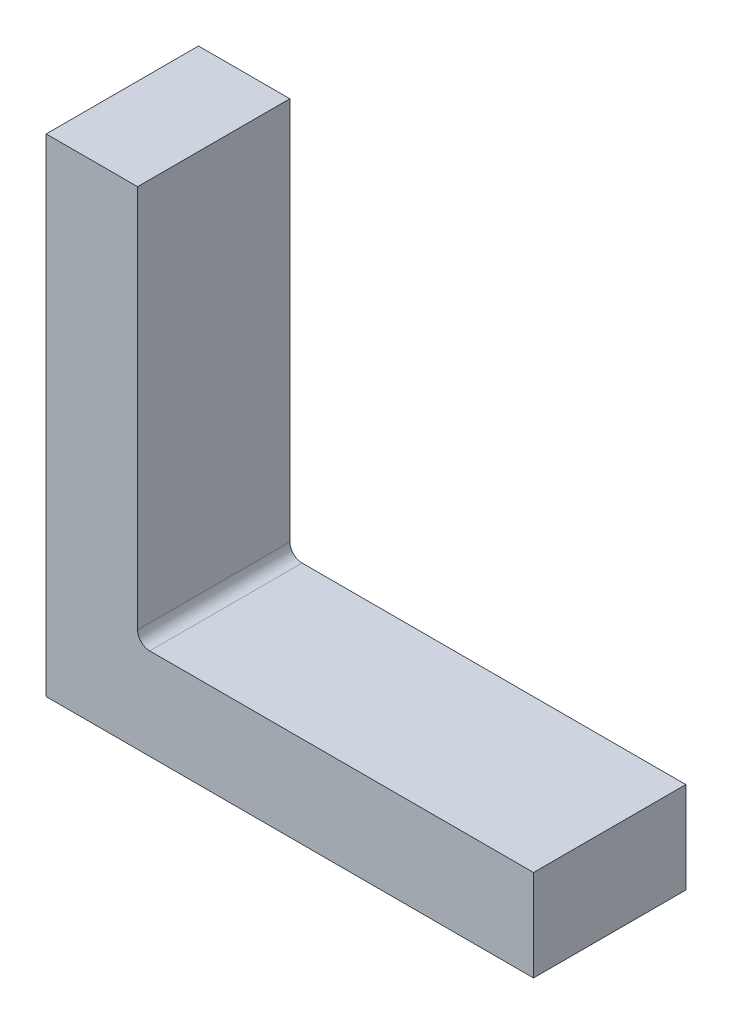
ISO-10303-21;
HEADER;
FILE_DESCRIPTION(('STEP AP214'),'2;1');
FILE_NAME('part.step','',(''),(''),'','','');
FILE_SCHEMA(('AUTOMOTIVE_DESIGN { 1 0 10303 214 1 1 1 1 }'));
ENDSEC;
DATA;
#1=APPLICATION_CONTEXT('core data for automotive mechanical design processes');
#2=APPLICATION_PROTOCOL_DEFINITION('international standard','automotive_design',2000,#1);
#3=PRODUCT_CONTEXT('',#1,'mechanical');
#4=PRODUCT('Part','Part','',(#3));
#5=PRODUCT_RELATED_PRODUCT_CATEGORY('part','',(#4));
#6=PRODUCT_DEFINITION_FORMATION('','',#4);
#7=PRODUCT_DEFINITION_CONTEXT('part definition',#1,'design');
#8=PRODUCT_DEFINITION('design','',#6,#7);
#9=PRODUCT_DEFINITION_SHAPE('','',#8);
#10=(LENGTH_UNIT() NAMED_UNIT(*) SI_UNIT(.MILLI.,.METRE.));
#11=(NAMED_UNIT(*) PLANE_ANGLE_UNIT() SI_UNIT($,.RADIAN.));
#12=(NAMED_UNIT(*) SI_UNIT($,.STERADIAN.) SOLID_ANGLE_UNIT());
#13=UNCERTAINTY_MEASURE_WITH_UNIT(LENGTH_MEASURE(1.E-05),#10,'distance_accuracy_value','');
#14=(GEOMETRIC_REPRESENTATION_CONTEXT(3) GLOBAL_UNCERTAINTY_ASSIGNED_CONTEXT((#13)) GLOBAL_UNIT_ASSIGNED_CONTEXT((#10,
#11,#12)) REPRESENTATION_CONTEXT('',''));
#15=CARTESIAN_POINT('',(0.,0.,0.));
#16=DIRECTION('',(0.,0.,1.));
#17=DIRECTION('',(1.,0.,0.));
#18=AXIS2_PLACEMENT_3D('',#15,#16,#17);
#19=CARTESIAN_POINT('',(0.,0.,31.75));
#20=DIRECTION('',(1.,0.,0.));
#21=DIRECTION('',(0.,0.,-1.));
#22=AXIS2_PLACEMENT_3D('',#19,#20,#21);
#23=PLANE('',#22);
#24=DIRECTION('',(0.,-1.,0.));
#25=VECTOR('',#24,1.);
#26=CARTESIAN_POINT('',(0.,0.,0.));
#27=LINE('',#26,#25);
#28=CARTESIAN_POINT('',(0.,101.6,0.));
#29=VERTEX_POINT('',#28);
#30=CARTESIAN_POINT('',(0.,0.,0.));
#31=VERTEX_POINT('',#30);
#32=EDGE_CURVE('E133',#29,#31,#27,.T.);
#33=ORIENTED_EDGE('',*,*,#32,.T.);
#34=DIRECTION('',(0.,0.,-1.));
#35=VECTOR('',#34,1.);
#36=CARTESIAN_POINT('',(0.,0.,31.75));
#37=LINE('',#36,#35);
#38=CARTESIAN_POINT('',(0.,0.,31.75));
#39=VERTEX_POINT('',#38);
#40=EDGE_CURVE('E112',#39,#31,#37,.T.);
#41=ORIENTED_EDGE('',*,*,#40,.F.);
#42=DIRECTION('',(0.,-1.,0.));
#43=VECTOR('',#42,1.);
#44=CARTESIAN_POINT('',(0.,0.,31.75));
#45=LINE('',#44,#43);
#46=CARTESIAN_POINT('',(0.,101.6,31.75));
#47=VERTEX_POINT('',#46);
#48=EDGE_CURVE('E120',#47,#39,#45,.T.);
#49=ORIENTED_EDGE('',*,*,#48,.F.);
#50=DIRECTION('',(0.,0.,-1.));
#51=VECTOR('',#50,1.);
#52=CARTESIAN_POINT('',(0.,101.6,31.75));
#53=LINE('',#52,#51);
#54=EDGE_CURVE('E157',#47,#29,#53,.T.);
#55=ORIENTED_EDGE('',*,*,#54,.T.);
#56=EDGE_LOOP('',(#33,#41,#49,#55));
#57=FACE_BOUND('',#56,.T.);
#58=ADVANCED_FACE('F48',(#57),#23,.F.);
#59=CARTESIAN_POINT('',(0.,0.,31.75));
#60=DIRECTION('',(0.,1.,0.));
#61=DIRECTION('',(0.,0.,1.));
#62=AXIS2_PLACEMENT_3D('',#59,#60,#61);
#63=PLANE('',#62);
#64=DIRECTION('',(1.,0.,0.));
#65=VECTOR('',#64,1.);
#66=CARTESIAN_POINT('',(0.,0.,0.));
#67=LINE('',#66,#65);
#68=CARTESIAN_POINT('',(101.6,0.,0.));
#69=VERTEX_POINT('',#68);
#70=EDGE_CURVE('E178',#31,#69,#67,.T.);
#71=ORIENTED_EDGE('',*,*,#70,.T.);
#72=DIRECTION('',(0.,0.,-1.));
#73=VECTOR('',#72,1.);
#74=CARTESIAN_POINT('',(101.6,0.,31.75));
#75=LINE('',#74,#73);
#76=CARTESIAN_POINT('',(101.6,0.,31.75));
#77=VERTEX_POINT('',#76);
#78=EDGE_CURVE('E115',#77,#69,#75,.T.);
#79=ORIENTED_EDGE('',*,*,#78,.F.);
#80=DIRECTION('',(1.,0.,0.));
#81=VECTOR('',#80,1.);
#82=CARTESIAN_POINT('',(0.,0.,31.75));
#83=LINE('',#82,#81);
#84=EDGE_CURVE('E108',#39,#77,#83,.T.);
#85=ORIENTED_EDGE('',*,*,#84,.F.);
#86=ORIENTED_EDGE('',*,*,#40,.T.);
#87=EDGE_LOOP('',(#71,#79,#85,#86));
#88=FACE_BOUND('',#87,.T.);
#89=ADVANCED_FACE('F110',(#88),#63,.F.);
#90=CARTESIAN_POINT('',(101.6,0.,31.75));
#91=DIRECTION('',(-1.,0.,0.));
#92=DIRECTION('',(0.,0.,1.));
#93=AXIS2_PLACEMENT_3D('',#90,#91,#92);
#94=PLANE('',#93);
#95=DIRECTION('',(0.,1.,0.));
#96=VECTOR('',#95,1.);
#97=CARTESIAN_POINT('',(101.6,0.,0.));
#98=LINE('',#97,#96);
#99=CARTESIAN_POINT('',(101.6,19.05,0.));
#100=VERTEX_POINT('',#99);
#101=EDGE_CURVE('E174',#69,#100,#98,.T.);
#102=ORIENTED_EDGE('',*,*,#101,.T.);
#103=DIRECTION('',(0.,0.,-1.));
#104=VECTOR('',#103,1.);
#105=CARTESIAN_POINT('',(101.6,19.05,31.75));
#106=LINE('',#105,#104);
#107=CARTESIAN_POINT('',(101.6,19.05,31.75));
#108=VERTEX_POINT('',#107);
#109=EDGE_CURVE('E141',#108,#100,#106,.T.);
#110=ORIENTED_EDGE('',*,*,#109,.F.);
#111=DIRECTION('',(0.,1.,0.));
#112=VECTOR('',#111,1.);
#113=CARTESIAN_POINT('',(101.6,0.,31.75));
#114=LINE('',#113,#112);
#115=EDGE_CURVE('E119',#77,#108,#114,.T.);
#116=ORIENTED_EDGE('',*,*,#115,.F.);
#117=ORIENTED_EDGE('',*,*,#78,.T.);
#118=EDGE_LOOP('',(#102,#110,#116,#117));
#119=FACE_BOUND('',#118,.T.);
#120=ADVANCED_FACE('F194',(#119),#94,.F.);
#121=CARTESIAN_POINT('',(19.05,19.05,31.75));
#122=DIRECTION('',(0.,-1.,0.));
#123=DIRECTION('',(0.,0.,-1.));
#124=AXIS2_PLACEMENT_3D('',#121,#122,#123);
#125=PLANE('',#124);
#126=DIRECTION('',(-1.,0.,0.));
#127=VECTOR('',#126,1.);
#128=CARTESIAN_POINT('',(19.05,19.05,0.));
#129=LINE('',#128,#127);
#130=CARTESIAN_POINT('',(21.59,19.05,0.));
#131=VERTEX_POINT('',#130);
#132=EDGE_CURVE('E169',#100,#131,#129,.T.);
#133=ORIENTED_EDGE('',*,*,#132,.T.);
#134=DIRECTION('',(0.,0.,-1.));
#135=VECTOR('',#134,1.);
#136=CARTESIAN_POINT('',(21.59,19.05,31.75));
#137=LINE('',#136,#135);
#138=CARTESIAN_POINT('',(21.59,19.05,31.75));
#139=VERTEX_POINT('',#138);
#140=EDGE_CURVE('E64',#131,#139,#137,.F.);
#141=ORIENTED_EDGE('',*,*,#140,.T.);
#142=DIRECTION('',(-1.,0.,0.));
#143=VECTOR('',#142,1.);
#144=CARTESIAN_POINT('',(19.05,19.05,31.75));
#145=LINE('',#144,#143);
#146=EDGE_CURVE('E170',#108,#139,#145,.T.);
#147=ORIENTED_EDGE('',*,*,#146,.F.);
#148=ORIENTED_EDGE('',*,*,#109,.T.);
#149=EDGE_LOOP('',(#133,#141,#147,#148));
#150=FACE_BOUND('',#149,.T.);
#151=ADVANCED_FACE('F168',(#150),#125,.F.);
#152=CARTESIAN_POINT('',(19.05,101.6,31.75));
#153=DIRECTION('',(-1.,0.,0.));
#154=DIRECTION('',(0.,-1.,0.));
#155=AXIS2_PLACEMENT_3D('',#152,#153,#154);
#156=PLANE('',#155);
#157=DIRECTION('',(0.,1.,0.));
#158=VECTOR('',#157,1.);
#159=CARTESIAN_POINT('',(19.05,101.6,31.75));
#160=LINE('',#159,#158);
#161=CARTESIAN_POINT('',(19.05,21.59,31.75));
#162=VERTEX_POINT('',#161);
#163=CARTESIAN_POINT('',(19.05,101.6,31.75));
#164=VERTEX_POINT('',#163);
#165=EDGE_CURVE('E187',#162,#164,#160,.T.);
#166=ORIENTED_EDGE('',*,*,#165,.F.);
#167=DIRECTION('',(0.,0.,-1.));
#168=VECTOR('',#167,1.);
#169=CARTESIAN_POINT('',(19.05,21.59,0.));
#170=LINE('',#169,#168);
#171=CARTESIAN_POINT('',(19.05,21.59,0.));
#172=VERTEX_POINT('',#171);
#173=EDGE_CURVE('E135',#162,#172,#170,.T.);
#174=ORIENTED_EDGE('',*,*,#173,.T.);
#175=DIRECTION('',(0.,1.,0.));
#176=VECTOR('',#175,1.);
#177=CARTESIAN_POINT('',(19.05,101.6,0.));
#178=LINE('',#177,#176);
#179=CARTESIAN_POINT('',(19.05,101.6,0.));
#180=VERTEX_POINT('',#179);
#181=EDGE_CURVE('E155',#172,#180,#178,.T.);
#182=ORIENTED_EDGE('',*,*,#181,.T.);
#183=DIRECTION('',(0.,0.,-1.));
#184=VECTOR('',#183,1.);
#185=CARTESIAN_POINT('',(19.05,101.6,31.75));
#186=LINE('',#185,#184);
#187=EDGE_CURVE('E159',#164,#180,#186,.T.);
#188=ORIENTED_EDGE('',*,*,#187,.F.);
#189=EDGE_LOOP('',(#166,#174,#182,#188));
#190=FACE_BOUND('',#189,.T.);
#191=ADVANCED_FACE('F200',(#190),#156,.F.);
#192=CARTESIAN_POINT('',(0.,101.6,31.75));
#193=DIRECTION('',(0.,-1.,0.));
#194=DIRECTION('',(0.,0.,-1.));
#195=AXIS2_PLACEMENT_3D('',#192,#193,#194);
#196=PLANE('',#195);
#197=DIRECTION('',(-1.,0.,0.));
#198=VECTOR('',#197,1.);
#199=CARTESIAN_POINT('',(0.,101.6,0.));
#200=LINE('',#199,#198);
#201=EDGE_CURVE('E130',#180,#29,#200,.T.);
#202=ORIENTED_EDGE('',*,*,#201,.T.);
#203=ORIENTED_EDGE('',*,*,#54,.F.);
#204=DIRECTION('',(-1.,0.,0.));
#205=VECTOR('',#204,1.);
#206=CARTESIAN_POINT('',(0.,101.6,31.75));
#207=LINE('',#206,#205);
#208=EDGE_CURVE('E125',#164,#47,#207,.T.);
#209=ORIENTED_EDGE('',*,*,#208,.F.);
#210=ORIENTED_EDGE('',*,*,#187,.T.);
#211=EDGE_LOOP('',(#202,#203,#209,#210));
#212=FACE_BOUND('',#211,.T.);
#213=ADVANCED_FACE('F229',(#212),#196,.F.);
#214=CARTESIAN_POINT('',(0.,101.6,31.75));
#215=DIRECTION('',(0.,0.,-1.));
#216=DIRECTION('',(-1.,0.,0.));
#217=AXIS2_PLACEMENT_3D('',#214,#215,#216);
#218=PLANE('',#217);
#219=ORIENTED_EDGE('',*,*,#48,.T.);
#220=ORIENTED_EDGE('',*,*,#84,.T.);
#221=ORIENTED_EDGE('',*,*,#115,.T.);
#222=ORIENTED_EDGE('',*,*,#146,.T.);
#223=CARTESIAN_POINT('',(21.59,21.59,31.75));
#224=DIRECTION('',(0.,0.,-1.));
#225=DIRECTION('',(-1.,0.,0.));
#226=AXIS2_PLACEMENT_3D('',#223,#224,#225);
#227=CIRCLE('',#226,2.54);
#228=EDGE_CURVE('E12',#139,#162,#227,.T.);
#229=ORIENTED_EDGE('',*,*,#228,.T.);
#230=ORIENTED_EDGE('',*,*,#165,.T.);
#231=ORIENTED_EDGE('',*,*,#208,.T.);
#232=EDGE_LOOP('',(#219,#220,#221,#222,#229,#230,#231));
#233=FACE_BOUND('',#232,.T.);
#234=ADVANCED_FACE('F123',(#233),#218,.F.);
#235=CARTESIAN_POINT('',(0.,101.6,0.));
#236=DIRECTION('',(0.,0.,-1.));
#237=DIRECTION('',(-1.,0.,0.));
#238=AXIS2_PLACEMENT_3D('',#235,#236,#237);
#239=PLANE('',#238);
#240=ORIENTED_EDGE('',*,*,#32,.F.);
#241=ORIENTED_EDGE('',*,*,#201,.F.);
#242=ORIENTED_EDGE('',*,*,#181,.F.);
#243=CARTESIAN_POINT('',(21.59,21.59,0.));
#244=DIRECTION('',(0.,0.,-1.));
#245=DIRECTION('',(-1.,0.,0.));
#246=AXIS2_PLACEMENT_3D('',#243,#244,#245);
#247=CIRCLE('',#246,2.54);
#248=EDGE_CURVE('E57',#172,#131,#247,.F.);
#249=ORIENTED_EDGE('',*,*,#248,.T.);
#250=ORIENTED_EDGE('',*,*,#132,.F.);
#251=ORIENTED_EDGE('',*,*,#101,.F.);
#252=ORIENTED_EDGE('',*,*,#70,.F.);
#253=EDGE_LOOP('',(#240,#241,#242,#249,#250,#251,#252));
#254=FACE_BOUND('',#253,.T.);
#255=ADVANCED_FACE('F173',(#254),#239,.T.);
#256=CARTESIAN_POINT('',(21.59,21.59,31.75));
#257=DIRECTION('',(0.,0.,1.));
#258=DIRECTION('',(1.,0.,0.));
#259=AXIS2_PLACEMENT_3D('',#256,#257,#258);
#260=CYLINDRICAL_SURFACE('',#259,2.54);
#261=ORIENTED_EDGE('',*,*,#228,.F.);
#262=ORIENTED_EDGE('',*,*,#140,.F.);
#263=ORIENTED_EDGE('',*,*,#248,.F.);
#264=ORIENTED_EDGE('',*,*,#173,.F.);
#265=EDGE_LOOP('',(#261,#262,#263,#264));
#266=FACE_BOUND('',#265,.T.);
#267=ADVANCED_FACE('F50',(#266),#260,.F.);
#268=CLOSED_SHELL('',(#58,#89,#120,#151,#191,#213,#234,#255,#267));
#269=MANIFOLD_SOLID_BREP('B2',#268);
#270=ADVANCED_BREP_SHAPE_REPRESENTATION('',(#18,#269),#14);
#271=SHAPE_DEFINITION_REPRESENTATION(#9,#270);
ENDSEC;
END-ISO-10303-21;
